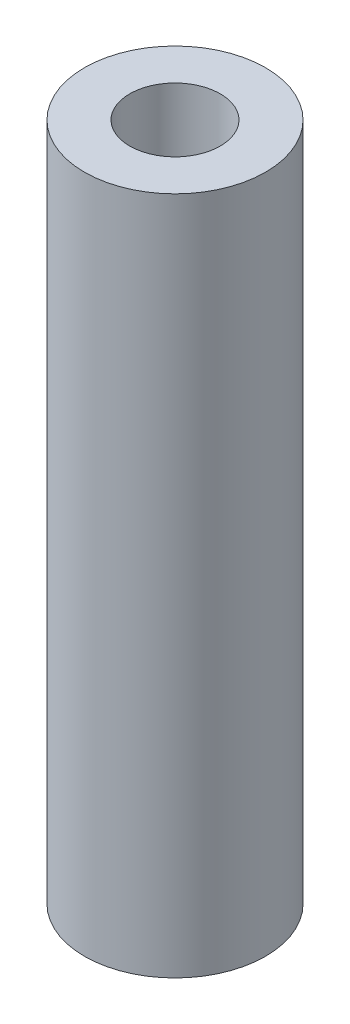
ISO-10303-21;
HEADER;
FILE_DESCRIPTION(('STEP AP214'),'2;1');
FILE_NAME('part.step','',(''),(''),'','','');
FILE_SCHEMA(('AUTOMOTIVE_DESIGN { 1 0 10303 214 1 1 1 1 }'));
ENDSEC;
DATA;
#1=APPLICATION_CONTEXT('core data for automotive mechanical design processes');
#2=APPLICATION_PROTOCOL_DEFINITION('international standard','automotive_design',2000,#1);
#3=PRODUCT_CONTEXT('',#1,'mechanical');
#4=PRODUCT('Part','Part','',(#3));
#5=PRODUCT_RELATED_PRODUCT_CATEGORY('part','',(#4));
#6=PRODUCT_DEFINITION_FORMATION('','',#4);
#7=PRODUCT_DEFINITION_CONTEXT('part definition',#1,'design');
#8=PRODUCT_DEFINITION('design','',#6,#7);
#9=PRODUCT_DEFINITION_SHAPE('','',#8);
#10=(LENGTH_UNIT() NAMED_UNIT(*) SI_UNIT(.MILLI.,.METRE.));
#11=(NAMED_UNIT(*) PLANE_ANGLE_UNIT() SI_UNIT($,.RADIAN.));
#12=(NAMED_UNIT(*) SI_UNIT($,.STERADIAN.) SOLID_ANGLE_UNIT());
#13=UNCERTAINTY_MEASURE_WITH_UNIT(LENGTH_MEASURE(1.E-05),#10,'distance_accuracy_value','');
#14=(GEOMETRIC_REPRESENTATION_CONTEXT(3) GLOBAL_UNCERTAINTY_ASSIGNED_CONTEXT((#13)) GLOBAL_UNIT_ASSIGNED_CONTEXT((#10,
#11,#12)) REPRESENTATION_CONTEXT('',''));
#15=CARTESIAN_POINT('',(0.,0.,0.));
#16=DIRECTION('',(0.,0.,1.));
#17=DIRECTION('',(1.,0.,0.));
#18=AXIS2_PLACEMENT_3D('',#15,#16,#17);
#19=CARTESIAN_POINT('',(0.,30.,0.));
#20=DIRECTION('',(0.,1.,0.));
#21=DIRECTION('',(0.,0.,1.));
#22=AXIS2_PLACEMENT_3D('',#19,#20,#21);
#23=PLANE('',#22);
#24=CARTESIAN_POINT('',(0.,30.,0.));
#25=DIRECTION('',(0.,1.,0.));
#26=DIRECTION('',(0.,0.,1.));
#27=AXIS2_PLACEMENT_3D('',#24,#25,#26);
#28=CIRCLE('',#27,4.);
#29=CARTESIAN_POINT('',(0.,30.,4.));
#30=VERTEX_POINT('',#29);
#31=EDGE_CURVE('E10',#30,#30,#28,.T.);
#32=ORIENTED_EDGE('',*,*,#31,.T.);
#33=EDGE_LOOP('',(#32));
#34=FACE_BOUND('',#33,.T.);
#35=CARTESIAN_POINT('',(0.,30.,0.));
#36=DIRECTION('',(0.,1.,0.));
#37=DIRECTION('',(0.,0.,1.));
#38=AXIS2_PLACEMENT_3D('',#35,#36,#37);
#39=CIRCLE('',#38,2.);
#40=CARTESIAN_POINT('',(0.,30.,2.));
#41=VERTEX_POINT('',#40);
#42=EDGE_CURVE('E44',#41,#41,#39,.T.);
#43=ORIENTED_EDGE('',*,*,#42,.F.);
#44=EDGE_LOOP('',(#43));
#45=FACE_BOUND('',#44,.T.);
#46=ADVANCED_FACE('F33',(#34,#45),#23,.T.);
#47=CARTESIAN_POINT('',(0.,0.,0.));
#48=DIRECTION('',(0.,1.,0.));
#49=DIRECTION('',(0.,0.,1.));
#50=AXIS2_PLACEMENT_3D('',#47,#48,#49);
#51=PLANE('',#50);
#52=CARTESIAN_POINT('',(0.,0.,0.));
#53=DIRECTION('',(0.,1.,0.));
#54=DIRECTION('',(0.,0.,1.));
#55=AXIS2_PLACEMENT_3D('',#52,#53,#54);
#56=CIRCLE('',#55,4.);
#57=CARTESIAN_POINT('',(0.,0.,4.));
#58=VERTEX_POINT('',#57);
#59=EDGE_CURVE('E37',#58,#58,#56,.T.);
#60=ORIENTED_EDGE('',*,*,#59,.F.);
#61=EDGE_LOOP('',(#60));
#62=FACE_BOUND('',#61,.T.);
#63=CARTESIAN_POINT('',(0.,0.,0.));
#64=DIRECTION('',(0.,1.,0.));
#65=DIRECTION('',(0.,0.,1.));
#66=AXIS2_PLACEMENT_3D('',#63,#64,#65);
#67=CIRCLE('',#66,2.);
#68=CARTESIAN_POINT('',(0.,0.,2.));
#69=VERTEX_POINT('',#68);
#70=EDGE_CURVE('E46',#69,#69,#67,.T.);
#71=ORIENTED_EDGE('',*,*,#70,.T.);
#72=EDGE_LOOP('',(#71));
#73=FACE_BOUND('',#72,.T.);
#74=ADVANCED_FACE('F56',(#62,#73),#51,.F.);
#75=CARTESIAN_POINT('',(0.,30.,0.));
#76=DIRECTION('',(0.,-1.,0.));
#77=DIRECTION('',(0.,0.,-1.));
#78=AXIS2_PLACEMENT_3D('',#75,#76,#77);
#79=CYLINDRICAL_SURFACE('',#78,4.);
#80=ORIENTED_EDGE('',*,*,#31,.F.);
#81=EDGE_LOOP('',(#80));
#82=FACE_BOUND('',#81,.T.);
#83=ORIENTED_EDGE('',*,*,#59,.T.);
#84=EDGE_LOOP('',(#83));
#85=FACE_BOUND('',#84,.T.);
#86=ADVANCED_FACE('F35',(#82,#85),#79,.T.);
#87=CARTESIAN_POINT('',(0.,30.,0.));
#88=DIRECTION('',(0.,-1.,0.));
#89=DIRECTION('',(0.,0.,-1.));
#90=AXIS2_PLACEMENT_3D('',#87,#88,#89);
#91=CYLINDRICAL_SURFACE('',#90,2.);
#92=ORIENTED_EDGE('',*,*,#42,.T.);
#93=EDGE_LOOP('',(#92));
#94=FACE_BOUND('',#93,.T.);
#95=ORIENTED_EDGE('',*,*,#70,.F.);
#96=EDGE_LOOP('',(#95));
#97=FACE_BOUND('',#96,.T.);
#98=ADVANCED_FACE('F52',(#94,#97),#91,.F.);
#99=CLOSED_SHELL('',(#46,#74,#86,#98));
#100=MANIFOLD_SOLID_BREP('B2',#99);
#101=ADVANCED_BREP_SHAPE_REPRESENTATION('',(#18,#100),#14);
#102=SHAPE_DEFINITION_REPRESENTATION(#9,#101);
ENDSEC;
END-ISO-10303-21;
